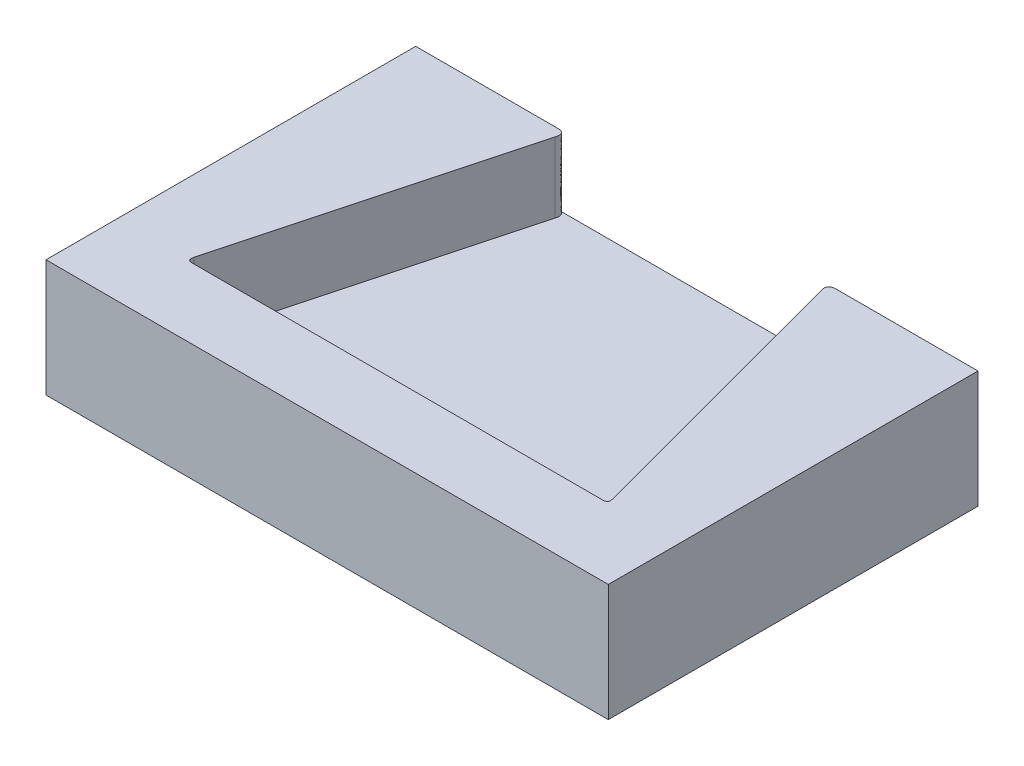
ISO-10303-21;
HEADER;
FILE_DESCRIPTION(('STEP AP214'),'2;1');
FILE_NAME('part.step','',(''),(''),'','','');
FILE_SCHEMA(('AUTOMOTIVE_DESIGN { 1 0 10303 214 1 1 1 1 }'));
ENDSEC;
DATA;
#1=APPLICATION_CONTEXT('core data for automotive mechanical design processes');
#2=APPLICATION_PROTOCOL_DEFINITION('international standard','automotive_design',2000,#1);
#3=PRODUCT_CONTEXT('',#1,'mechanical');
#4=PRODUCT('Part','Part','',(#3));
#5=PRODUCT_RELATED_PRODUCT_CATEGORY('part','',(#4));
#6=PRODUCT_DEFINITION_FORMATION('','',#4);
#7=PRODUCT_DEFINITION_CONTEXT('part definition',#1,'design');
#8=PRODUCT_DEFINITION('design','',#6,#7);
#9=PRODUCT_DEFINITION_SHAPE('','',#8);
#10=(LENGTH_UNIT() NAMED_UNIT(*) SI_UNIT(.MILLI.,.METRE.));
#11=(NAMED_UNIT(*) PLANE_ANGLE_UNIT() SI_UNIT($,.RADIAN.));
#12=(NAMED_UNIT(*) SI_UNIT($,.STERADIAN.) SOLID_ANGLE_UNIT());
#13=UNCERTAINTY_MEASURE_WITH_UNIT(LENGTH_MEASURE(1.E-05),#10,'distance_accuracy_value','');
#14=(GEOMETRIC_REPRESENTATION_CONTEXT(3) GLOBAL_UNCERTAINTY_ASSIGNED_CONTEXT((#13)) GLOBAL_UNIT_ASSIGNED_CONTEXT((#10,
#11,#12)) REPRESENTATION_CONTEXT('',''));
#15=CARTESIAN_POINT('',(0.,0.,0.));
#16=DIRECTION('',(0.,0.,1.));
#17=DIRECTION('',(1.,0.,0.));
#18=AXIS2_PLACEMENT_3D('',#15,#16,#17);
#19=CARTESIAN_POINT('',(0.,5.,0.));
#20=DIRECTION('',(1.,0.,0.));
#21=DIRECTION('',(0.,0.,-1.));
#22=AXIS2_PLACEMENT_3D('',#19,#20,#21);
#23=PLANE('',#22);
#24=DIRECTION('',(0.,0.,1.));
#25=VECTOR('',#24,1.);
#26=CARTESIAN_POINT('',(0.,0.,0.));
#27=LINE('',#26,#25);
#28=CARTESIAN_POINT('',(0.,0.,-15.78));
#29=VERTEX_POINT('',#28);
#30=CARTESIAN_POINT('',(0.,0.,0.));
#31=VERTEX_POINT('',#30);
#32=EDGE_CURVE('E163',#29,#31,#27,.T.);
#33=ORIENTED_EDGE('',*,*,#32,.T.);
#34=DIRECTION('',(0.,-1.,0.));
#35=VECTOR('',#34,1.);
#36=CARTESIAN_POINT('',(0.,5.,0.));
#37=LINE('',#36,#35);
#38=CARTESIAN_POINT('',(0.,5.,0.));
#39=VERTEX_POINT('',#38);
#40=EDGE_CURVE('E143',#39,#31,#37,.T.);
#41=ORIENTED_EDGE('',*,*,#40,.F.);
#42=DIRECTION('',(0.,0.,1.));
#43=VECTOR('',#42,1.);
#44=CARTESIAN_POINT('',(0.,5.,0.));
#45=LINE('',#44,#43);
#46=CARTESIAN_POINT('',(0.,5.,-15.78));
#47=VERTEX_POINT('',#46);
#48=EDGE_CURVE('E150',#47,#39,#45,.T.);
#49=ORIENTED_EDGE('',*,*,#48,.F.);
#50=DIRECTION('',(0.,-1.,0.));
#51=VECTOR('',#50,1.);
#52=CARTESIAN_POINT('',(0.,5.,-15.78));
#53=LINE('',#52,#51);
#54=EDGE_CURVE('E195',#47,#29,#53,.T.);
#55=ORIENTED_EDGE('',*,*,#54,.T.);
#56=EDGE_LOOP('',(#33,#41,#49,#55));
#57=FACE_BOUND('',#56,.T.);
#58=ADVANCED_FACE('F43',(#57),#23,.F.);
#59=CARTESIAN_POINT('',(0.,5.,0.));
#60=DIRECTION('',(0.,0.,-1.));
#61=DIRECTION('',(-1.,0.,0.));
#62=AXIS2_PLACEMENT_3D('',#59,#60,#61);
#63=PLANE('',#62);
#64=DIRECTION('',(1.,0.,0.));
#65=VECTOR('',#64,1.);
#66=CARTESIAN_POINT('',(0.,0.,0.));
#67=LINE('',#66,#65);
#68=CARTESIAN_POINT('',(24.,0.,0.));
#69=VERTEX_POINT('',#68);
#70=EDGE_CURVE('E529',#31,#69,#67,.T.);
#71=ORIENTED_EDGE('',*,*,#70,.T.);
#72=DIRECTION('',(0.,-1.,0.));
#73=VECTOR('',#72,1.);
#74=CARTESIAN_POINT('',(24.,5.,0.));
#75=LINE('',#74,#73);
#76=CARTESIAN_POINT('',(24.,5.,0.));
#77=VERTEX_POINT('',#76);
#78=EDGE_CURVE('E146',#77,#69,#75,.T.);
#79=ORIENTED_EDGE('',*,*,#78,.F.);
#80=DIRECTION('',(1.,0.,0.));
#81=VECTOR('',#80,1.);
#82=CARTESIAN_POINT('',(0.,5.,0.));
#83=LINE('',#82,#81);
#84=EDGE_CURVE('E139',#39,#77,#83,.T.);
#85=ORIENTED_EDGE('',*,*,#84,.F.);
#86=ORIENTED_EDGE('',*,*,#40,.T.);
#87=EDGE_LOOP('',(#71,#79,#85,#86));
#88=FACE_BOUND('',#87,.T.);
#89=ADVANCED_FACE('F141',(#88),#63,.F.);
#90=CARTESIAN_POINT('',(24.,5.,0.));
#91=DIRECTION('',(-1.,0.,0.));
#92=DIRECTION('',(0.,0.,1.));
#93=AXIS2_PLACEMENT_3D('',#90,#91,#92);
#94=PLANE('',#93);
#95=DIRECTION('',(0.,0.,-1.));
#96=VECTOR('',#95,1.);
#97=CARTESIAN_POINT('',(24.,0.,0.));
#98=LINE('',#97,#96);
#99=CARTESIAN_POINT('',(24.,0.,-15.78));
#100=VERTEX_POINT('',#99);
#101=EDGE_CURVE('E530',#69,#100,#98,.T.);
#102=ORIENTED_EDGE('',*,*,#101,.T.);
#103=DIRECTION('',(0.,-1.,0.));
#104=VECTOR('',#103,1.);
#105=CARTESIAN_POINT('',(24.,5.,-15.78));
#106=LINE('',#105,#104);
#107=CARTESIAN_POINT('',(24.,5.,-15.78));
#108=VERTEX_POINT('',#107);
#109=EDGE_CURVE('E168',#108,#100,#106,.T.);
#110=ORIENTED_EDGE('',*,*,#109,.F.);
#111=DIRECTION('',(0.,0.,-1.));
#112=VECTOR('',#111,1.);
#113=CARTESIAN_POINT('',(24.,5.,0.));
#114=LINE('',#113,#112);
#115=EDGE_CURVE('E149',#77,#108,#114,.T.);
#116=ORIENTED_EDGE('',*,*,#115,.F.);
#117=ORIENTED_EDGE('',*,*,#78,.T.);
#118=EDGE_LOOP('',(#102,#110,#116,#117));
#119=FACE_BOUND('',#118,.T.);
#120=ADVANCED_FACE('F544',(#119),#94,.F.);
#121=CARTESIAN_POINT('',(0.,5.,-15.78));
#122=DIRECTION('',(0.,0.,1.));
#123=DIRECTION('',(1.,0.,0.));
#124=AXIS2_PLACEMENT_3D('',#121,#122,#123);
#125=PLANE('',#124);
#126=DIRECTION('',(-1.,0.,0.));
#127=VECTOR('',#126,1.);
#128=CARTESIAN_POINT('',(0.,5.,-15.78));
#129=LINE('',#128,#127);
#130=CARTESIAN_POINT('',(6.03342306741735,5.,-15.78));
#131=VERTEX_POINT('',#130);
#132=EDGE_CURVE('E156',#131,#47,#129,.T.);
#133=ORIENTED_EDGE('',*,*,#132,.F.);
#134=CARTESIAN_POINT('',(6.03342306741735,1.85,-15.78));
#135=CARTESIAN_POINT('',(6.03342306741735,2.94999999999991,-15.78));
#136=CARTESIAN_POINT('',(6.03342306741735,4.05000000000191,-15.78));
#137=CARTESIAN_POINT('',(6.03342306741735,5.15,-15.78));
#138=B_SPLINE_CURVE_WITH_KNOTS('',3,(#134,#135,#136,#137),.UNSPECIFIED.,.F.,.F.,(4,4),(-0.00015,
0.00315),.UNSPECIFIED.);
#139=CARTESIAN_POINT('',(6.03342306741735,2.,-15.78));
#140=VERTEX_POINT('',#139);
#141=EDGE_CURVE('E479',#131,#140,#138,.F.);
#142=ORIENTED_EDGE('',*,*,#141,.T.);
#143=DIRECTION('',(-1.,0.,0.));
#144=VECTOR('',#143,1.);
#145=CARTESIAN_POINT('',(17.5756093207303,2.,-15.78));
#146=LINE('',#145,#144);
#147=CARTESIAN_POINT('',(17.9665769325827,2.,-15.78));
#148=VERTEX_POINT('',#147);
#149=EDGE_CURVE('E71',#148,#140,#146,.T.);
#150=ORIENTED_EDGE('',*,*,#149,.F.);
#151=CARTESIAN_POINT('',(17.9665769325827,5.15,-15.78));
#152=CARTESIAN_POINT('',(17.9665769325827,4.04999999999985,-15.78));
#153=CARTESIAN_POINT('',(17.9665769325827,2.95,-15.78));
#154=CARTESIAN_POINT('',(17.9665769325827,1.85,-15.78));
#155=B_SPLINE_CURVE_WITH_KNOTS('',3,(#151,#152,#153,#154),.UNSPECIFIED.,.F.,.F.,(4,4),(-0.00315,
0.00015),.UNSPECIFIED.);
#156=CARTESIAN_POINT('',(17.9665769325827,5.,-15.78));
#157=VERTEX_POINT('',#156);
#158=EDGE_CURVE('E501',#148,#157,#155,.F.);
#159=ORIENTED_EDGE('',*,*,#158,.T.);
#160=EDGE_CURVE('E192',#108,#157,#129,.T.);
#161=ORIENTED_EDGE('',*,*,#160,.F.);
#162=ORIENTED_EDGE('',*,*,#109,.T.);
#163=DIRECTION('',(-1.,0.,0.));
#164=VECTOR('',#163,1.);
#165=CARTESIAN_POINT('',(0.,0.,-15.78));
#166=LINE('',#165,#164);
#167=EDGE_CURVE('E160',#100,#29,#166,.T.);
#168=ORIENTED_EDGE('',*,*,#167,.T.);
#169=ORIENTED_EDGE('',*,*,#54,.F.);
#170=EDGE_LOOP('',(#133,#142,#150,#159,#161,#162,#168,#169));
#171=FACE_BOUND('',#170,.T.);
#172=ADVANCED_FACE('F539',(#171),#125,.F.);
#173=CARTESIAN_POINT('',(0.,5.,0.));
#174=DIRECTION('',(0.,-1.,0.));
#175=DIRECTION('',(0.,0.,-1.));
#176=AXIS2_PLACEMENT_3D('',#173,#174,#175);
#177=PLANE('',#176);
#178=DIRECTION('',(-0.258819045102518,0.,0.965925826289069));
#179=VECTOR('',#178,1.);
#180=CARTESIAN_POINT('',(6.42439067926971,5.,-15.78));
#181=LINE('',#180,#179);
#182=CARTESIAN_POINT('',(6.32320081530407,5.,-15.4023542864692));
#183=VERTEX_POINT('',#182);
#184=CARTESIAN_POINT('',(3.06745990931043,5.,-3.2517638090205));
#185=VERTEX_POINT('',#184);
#186=EDGE_CURVE('E355',#183,#185,#181,.T.);
#187=ORIENTED_EDGE('',*,*,#186,.F.);
#188=CARTESIAN_POINT('',(6.03342306741735,5.,-15.78));
#189=CARTESIAN_POINT('',(6.09603295456339,5.,-15.78));
#190=CARTESIAN_POINT('',(6.15864284170943,5.,-15.78));
#191=CARTESIAN_POINT('',(6.29435593668985,5.,-15.7481926618959));
#192=CARTESIAN_POINT('',(6.36001168202481,5.,-15.6626284287026));
#193=CARTESIAN_POINT('',(6.3556100777143,5.,-15.5233073004201));
#194=CARTESIAN_POINT('',(6.33940544650918,5.,-15.4628307934446));
#195=CARTESIAN_POINT('',(6.32320081530407,5.,-15.4023542864692));
#196=B_SPLINE_CURVE_WITH_KNOTS('',5,(#188,#189,#190,#191,#192,#193,#194,#195),.UNSPECIFIED.,.F.,
.F.,(6,2,6),(0.,0.5,1.),.UNSPECIFIED.);
#197=EDGE_CURVE('E439',#183,#131,#196,.F.);
#198=ORIENTED_EDGE('',*,*,#197,.T.);
#199=ORIENTED_EDGE('',*,*,#132,.T.);
#200=ORIENTED_EDGE('',*,*,#48,.T.);
#201=ORIENTED_EDGE('',*,*,#84,.T.);
#202=ORIENTED_EDGE('',*,*,#115,.T.);
#203=ORIENTED_EDGE('',*,*,#160,.T.);
#204=CARTESIAN_POINT('',(17.6767991846959,5.,-15.4023542864692));
#205=CARTESIAN_POINT('',(17.6605945534908,5.,-15.4628307934446));
#206=CARTESIAN_POINT('',(17.6443899222857,5.,-15.5233073004201));
#207=CARTESIAN_POINT('',(17.6399883179752,5.,-15.6626284287026));
#208=CARTESIAN_POINT('',(17.7056440633101,5.,-15.7481926618959));
#209=CARTESIAN_POINT('',(17.8413571582906,5.,-15.78));
#210=CARTESIAN_POINT('',(17.9039670454366,5.,-15.78));
#211=CARTESIAN_POINT('',(17.9665769325827,5.,-15.78));
#212=B_SPLINE_CURVE_WITH_KNOTS('',5,(#204,#205,#206,#207,#208,#209,#210,#211),.UNSPECIFIED.,.F.,
.F.,(6,2,6),(0.,0.5,1.),.UNSPECIFIED.);
#213=CARTESIAN_POINT('',(17.6767991846959,5.,-15.4023542864693));
#214=VERTEX_POINT('',#213);
#215=EDGE_CURVE('E490',#157,#214,#212,.F.);
#216=ORIENTED_EDGE('',*,*,#215,.T.);
#217=DIRECTION('',(-0.258819045102518,0.,-0.965925826289069));
#218=VECTOR('',#217,1.);
#219=CARTESIAN_POINT('',(21.,5.,-3.));
#220=LINE('',#219,#218);
#221=CARTESIAN_POINT('',(20.9325400906896,5.,-3.2517638090205));
#222=VERTEX_POINT('',#221);
#223=EDGE_CURVE('E172',#222,#214,#220,.T.);
#224=ORIENTED_EDGE('',*,*,#223,.F.);
#225=CARTESIAN_POINT('',(20.7393549254318,5.,-3.));
#226=CARTESIAN_POINT('',(20.7810948501958,5.,-3.));
#227=CARTESIAN_POINT('',(20.8228347749598,5.,-3.));
#228=CARTESIAN_POINT('',(20.9133101716134,5.00000000000001,-3.02120489206938));
#229=CARTESIAN_POINT('',(20.9570806685034,5.00000000000001,-3.07824771419826));
#230=CARTESIAN_POINT('',(20.9541462656297,5.,-3.17112846638663));
#231=CARTESIAN_POINT('',(20.9433431781596,5.,-3.21144613770357));
#232=CARTESIAN_POINT('',(20.9325400906896,5.,-3.2517638090205));
#233=B_SPLINE_CURVE_WITH_KNOTS('',5,(#225,#226,#227,#228,#229,#230,#231,#232),.UNSPECIFIED.,.F.,
.F.,(6,2,6),(0.,0.5,1.),.UNSPECIFIED.);
#234=CARTESIAN_POINT('',(20.7393549254318,5.,-3.));
#235=VERTEX_POINT('',#234);
#236=EDGE_CURVE('E235',#222,#235,#233,.F.);
#237=ORIENTED_EDGE('',*,*,#236,.T.);
#238=DIRECTION('',(1.,0.,0.));
#239=VECTOR('',#238,1.);
#240=CARTESIAN_POINT('',(3.,5.,-3.));
#241=LINE('',#240,#239);
#242=CARTESIAN_POINT('',(3.26064507456824,5.,-3.));
#243=VERTEX_POINT('',#242);
#244=EDGE_CURVE('E175',#243,#235,#241,.T.);
#245=ORIENTED_EDGE('',*,*,#244,.F.);
#246=CARTESIAN_POINT('',(3.06745990931043,5.,-3.2517638090205));
#247=CARTESIAN_POINT('',(3.05665682184035,5.,-3.21144613770357));
#248=CARTESIAN_POINT('',(3.04585373437028,5.,-3.17112846638663));
#249=CARTESIAN_POINT('',(3.0429193314966,5.00000000000001,-3.07824771419826));
#250=CARTESIAN_POINT('',(3.08668982838657,5.00000000000001,-3.02120489206938));
#251=CARTESIAN_POINT('',(3.17716522504019,5.,-3.));
#252=CARTESIAN_POINT('',(3.21890514980422,5.,-3.));
#253=CARTESIAN_POINT('',(3.26064507456824,5.,-3.));
#254=B_SPLINE_CURVE_WITH_KNOTS('',5,(#246,#247,#248,#249,#250,#251,#252,#253),.UNSPECIFIED.,.F.,
.F.,(6,2,6),(0.,0.5,1.),.UNSPECIFIED.);
#255=EDGE_CURVE('E247',#243,#185,#254,.F.);
#256=ORIENTED_EDGE('',*,*,#255,.T.);
#257=EDGE_LOOP('',(#187,#198,#199,#200,#201,#202,#203,#216,#224,#237,#245,#256));
#258=FACE_BOUND('',#257,.T.);
#259=ADVANCED_FACE('F154',(#258),#177,.F.);
#260=CARTESIAN_POINT('',(0.,0.,0.));
#261=DIRECTION('',(0.,-1.,0.));
#262=DIRECTION('',(0.,0.,-1.));
#263=AXIS2_PLACEMENT_3D('',#260,#261,#262);
#264=PLANE('',#263);
#265=ORIENTED_EDGE('',*,*,#32,.F.);
#266=ORIENTED_EDGE('',*,*,#167,.F.);
#267=ORIENTED_EDGE('',*,*,#101,.F.);
#268=ORIENTED_EDGE('',*,*,#70,.F.);
#269=EDGE_LOOP('',(#265,#266,#267,#268));
#270=FACE_BOUND('',#269,.T.);
#271=ADVANCED_FACE('F543',(#270),#264,.T.);
#272=CARTESIAN_POINT('',(21.,2.,-3.));
#273=DIRECTION('',(0.965925826289069,0.,-0.258819045102518));
#274=DIRECTION('',(-0.258819045102518,0.,-0.965925826289069));
#275=AXIS2_PLACEMENT_3D('',#272,#273,#274);
#276=PLANE('',#275);
#277=ORIENTED_EDGE('',*,*,#223,.T.);
#278=CARTESIAN_POINT('',(17.6767991846959,1.85,-15.4023542864692));
#279=CARTESIAN_POINT('',(17.6767991846959,2.95,-15.4023542864692));
#280=CARTESIAN_POINT('',(17.6767991846959,4.04999999999985,-15.4023542864692));
#281=CARTESIAN_POINT('',(17.6767991846959,5.15,-15.4023542864692));
#282=B_SPLINE_CURVE_WITH_KNOTS('',3,(#278,#279,#280,#281),.UNSPECIFIED.,.F.,.F.,(4,4),(-0.00315,
0.00015),.UNSPECIFIED.);
#283=CARTESIAN_POINT('',(17.6767991846959,2.,-15.4023542864693));
#284=VERTEX_POINT('',#283);
#285=EDGE_CURVE('E63',#214,#284,#282,.F.);
#286=ORIENTED_EDGE('',*,*,#285,.T.);
#287=DIRECTION('',(-0.258819045102518,0.,-0.965925826289069));
#288=VECTOR('',#287,1.);
#289=CARTESIAN_POINT('',(21.,2.,-3.));
#290=LINE('',#289,#288);
#291=CARTESIAN_POINT('',(20.9325400906896,2.,-3.2517638090205));
#292=VERTEX_POINT('',#291);
#293=EDGE_CURVE('E176',#292,#284,#290,.T.);
#294=ORIENTED_EDGE('',*,*,#293,.F.);
#295=CARTESIAN_POINT('',(20.9325400906896,5.15,-3.2517638090205));
#296=CARTESIAN_POINT('',(20.9325400906896,4.05,-3.2517638090205));
#297=CARTESIAN_POINT('',(20.9325400906896,2.94999999999991,-3.2517638090205));
#298=CARTESIAN_POINT('',(20.9325400906896,1.85,-3.2517638090205));
#299=B_SPLINE_CURVE_WITH_KNOTS('',3,(#295,#296,#297,#298),.UNSPECIFIED.,.F.,.F.,(4,4),(-0.00315,
0.00015),.UNSPECIFIED.);
#300=EDGE_CURVE('E164',#292,#222,#299,.F.);
#301=ORIENTED_EDGE('',*,*,#300,.T.);
#302=EDGE_LOOP('',(#277,#286,#294,#301));
#303=FACE_BOUND('',#302,.T.);
#304=ADVANCED_FACE('F406',(#303),#276,.F.);
#305=CARTESIAN_POINT('',(3.,2.,-3.));
#306=DIRECTION('',(0.,0.,1.));
#307=DIRECTION('',(1.,0.,0.));
#308=AXIS2_PLACEMENT_3D('',#305,#306,#307);
#309=PLANE('',#308);
#310=ORIENTED_EDGE('',*,*,#244,.T.);
#311=CARTESIAN_POINT('',(20.7393549254318,1.85,-3.));
#312=CARTESIAN_POINT('',(20.7393549254318,2.94999999999991,-3.));
#313=CARTESIAN_POINT('',(20.7393549254318,4.05,-3.));
#314=CARTESIAN_POINT('',(20.7393549254318,5.15,-3.));
#315=B_SPLINE_CURVE_WITH_KNOTS('',3,(#311,#312,#313,#314),.UNSPECIFIED.,.F.,.F.,(4,4),(-0.00315,
0.00015),.UNSPECIFIED.);
#316=CARTESIAN_POINT('',(20.7393549254318,2.,-3.));
#317=VERTEX_POINT('',#316);
#318=EDGE_CURVE('E309',#235,#317,#315,.F.);
#319=ORIENTED_EDGE('',*,*,#318,.T.);
#320=DIRECTION('',(1.,0.,0.));
#321=VECTOR('',#320,1.);
#322=CARTESIAN_POINT('',(3.,2.,-3.));
#323=LINE('',#322,#321);
#324=CARTESIAN_POINT('',(3.26064507456824,2.,-3.));
#325=VERTEX_POINT('',#324);
#326=EDGE_CURVE('E369',#325,#317,#323,.T.);
#327=ORIENTED_EDGE('',*,*,#326,.F.);
#328=CARTESIAN_POINT('',(3.26064507456824,5.15,-3.));
#329=CARTESIAN_POINT('',(3.26064507456824,4.05,-3.));
#330=CARTESIAN_POINT('',(3.26064507456824,2.94999999999991,-3.));
#331=CARTESIAN_POINT('',(3.26064507456824,1.85,-3.));
#332=B_SPLINE_CURVE_WITH_KNOTS('',3,(#328,#329,#330,#331),.UNSPECIFIED.,.F.,.F.,(4,4),(-0.00315,
0.00015),.UNSPECIFIED.);
#333=EDGE_CURVE('E167',#325,#243,#332,.F.);
#334=ORIENTED_EDGE('',*,*,#333,.T.);
#335=EDGE_LOOP('',(#310,#319,#327,#334));
#336=FACE_BOUND('',#335,.T.);
#337=ADVANCED_FACE('F213',(#336),#309,.F.);
#338=CARTESIAN_POINT('',(6.42439067926971,2.,-15.78));
#339=DIRECTION('',(-0.965925826289069,0.,-0.258819045102518));
#340=DIRECTION('',(-0.258819045102518,0.,0.965925826289069));
#341=AXIS2_PLACEMENT_3D('',#338,#339,#340);
#342=PLANE('',#341);
#343=DIRECTION('',(-0.258819045102518,0.,0.965925826289069));
#344=VECTOR('',#343,1.);
#345=CARTESIAN_POINT('',(6.42439067926971,2.,-15.78));
#346=LINE('',#345,#344);
#347=CARTESIAN_POINT('',(6.32320081530407,2.,-15.4023542864692));
#348=VERTEX_POINT('',#347);
#349=CARTESIAN_POINT('',(3.06745990931043,2.,-3.2517638090205));
#350=VERTEX_POINT('',#349);
#351=EDGE_CURVE('E361',#348,#350,#346,.T.);
#352=ORIENTED_EDGE('',*,*,#351,.F.);
#353=CARTESIAN_POINT('',(6.32320081530407,5.15,-15.4023542864692));
#354=CARTESIAN_POINT('',(6.32320081530407,4.05000000000191,-15.4023542864692));
#355=CARTESIAN_POINT('',(6.32320081530407,2.94999999999991,-15.4023542864692));
#356=CARTESIAN_POINT('',(6.32320081530407,1.85,-15.4023542864692));
#357=B_SPLINE_CURVE_WITH_KNOTS('',3,(#353,#354,#355,#356),.UNSPECIFIED.,.F.,.F.,(4,4),(-0.00015,
0.00315),.UNSPECIFIED.);
#358=EDGE_CURVE('E545',#348,#183,#357,.F.);
#359=ORIENTED_EDGE('',*,*,#358,.T.);
#360=ORIENTED_EDGE('',*,*,#186,.T.);
#361=CARTESIAN_POINT('',(3.06745990931043,1.85,-3.2517638090205));
#362=CARTESIAN_POINT('',(3.06745990931043,2.94999999999991,-3.2517638090205));
#363=CARTESIAN_POINT('',(3.06745990931043,4.05,-3.2517638090205));
#364=CARTESIAN_POINT('',(3.06745990931043,5.15,-3.2517638090205));
#365=B_SPLINE_CURVE_WITH_KNOTS('',3,(#361,#362,#363,#364),.UNSPECIFIED.,.F.,.F.,(4,4),(-0.00315,
0.00015),.UNSPECIFIED.);
#366=EDGE_CURVE('E351',#185,#350,#365,.F.);
#367=ORIENTED_EDGE('',*,*,#366,.T.);
#368=EDGE_LOOP('',(#352,#359,#360,#367));
#369=FACE_BOUND('',#368,.T.);
#370=ADVANCED_FACE('F202',(#369),#342,.F.);
#371=CARTESIAN_POINT('',(0.,2.,0.));
#372=DIRECTION('',(0.,1.,0.));
#373=DIRECTION('',(0.,0.,1.));
#374=AXIS2_PLACEMENT_3D('',#371,#372,#373);
#375=PLANE('',#374);
#376=ORIENTED_EDGE('',*,*,#326,.T.);
#377=CARTESIAN_POINT('',(20.9325400906896,1.99999999999994,-3.2517638090205));
#378=CARTESIAN_POINT('',(20.9433431781596,1.99999999999994,-3.21144613770357));
#379=CARTESIAN_POINT('',(20.9541462656297,1.99999999999994,-3.17112846638663));
#380=CARTESIAN_POINT('',(20.9570806685034,2.0000000000001,-3.07824771419826));
#381=CARTESIAN_POINT('',(20.9133101716134,2.0000000000001,-3.02120489206938));
#382=CARTESIAN_POINT('',(20.8228347749598,1.99999999999994,-3.));
#383=CARTESIAN_POINT('',(20.7810948501958,1.99999999999994,-3.));
#384=CARTESIAN_POINT('',(20.7393549254318,1.99999999999994,-3.));
#385=B_SPLINE_CURVE_WITH_KNOTS('',5,(#377,#378,#379,#380,#381,#382,#383,#384),.UNSPECIFIED.,.F.,
.F.,(6,2,6),(0.,0.5,1.),.UNSPECIFIED.);
#386=EDGE_CURVE('E528',#317,#292,#385,.F.);
#387=ORIENTED_EDGE('',*,*,#386,.T.);
#388=ORIENTED_EDGE('',*,*,#293,.T.);
#389=CARTESIAN_POINT('',(17.9665769325827,2.,-15.78));
#390=CARTESIAN_POINT('',(17.9039670454366,2.,-15.78));
#391=CARTESIAN_POINT('',(17.8413571582906,2.,-15.78));
#392=CARTESIAN_POINT('',(17.7056440633101,2.,-15.7481926618959));
#393=CARTESIAN_POINT('',(17.6399883179752,2.,-15.6626284287026));
#394=CARTESIAN_POINT('',(17.6443899222857,2.,-15.5233073004201));
#395=CARTESIAN_POINT('',(17.6605945534908,2.,-15.4628307934446));
#396=CARTESIAN_POINT('',(17.6767991846959,2.,-15.4023542864692));
#397=B_SPLINE_CURVE_WITH_KNOTS('',5,(#389,#390,#391,#392,#393,#394,#395,#396),.UNSPECIFIED.,.F.,
.F.,(6,2,6),(0.,0.5,1.),.UNSPECIFIED.);
#398=EDGE_CURVE('E11',#284,#148,#397,.F.);
#399=ORIENTED_EDGE('',*,*,#398,.T.);
#400=ORIENTED_EDGE('',*,*,#149,.T.);
#401=CARTESIAN_POINT('',(6.32320081530407,1.99999999999995,-15.4023542864692));
#402=CARTESIAN_POINT('',(6.33940544650918,1.99999999999995,-15.4628307934446));
#403=CARTESIAN_POINT('',(6.3556100777143,1.99999999999995,-15.5233073004201));
#404=CARTESIAN_POINT('',(6.36001168202481,2.00000000000008,-15.6626284287026));
#405=CARTESIAN_POINT('',(6.29435593668986,2.00000000000008,-15.7481926618959));
#406=CARTESIAN_POINT('',(6.15864284170943,1.99999999999995,-15.78));
#407=CARTESIAN_POINT('',(6.09603295456339,1.99999999999995,-15.78));
#408=CARTESIAN_POINT('',(6.03342306741735,1.99999999999995,-15.78));
#409=B_SPLINE_CURVE_WITH_KNOTS('',5,(#401,#402,#403,#404,#405,#406,#407,#408),.UNSPECIFIED.,.F.,
.F.,(6,2,6),(0.,0.5,1.),.UNSPECIFIED.);
#410=EDGE_CURVE('E56',#140,#348,#409,.F.);
#411=ORIENTED_EDGE('',*,*,#410,.T.);
#412=ORIENTED_EDGE('',*,*,#351,.T.);
#413=CARTESIAN_POINT('',(3.26064507456824,1.99999999999994,-3.));
#414=CARTESIAN_POINT('',(3.21890514980422,1.99999999999994,-3.));
#415=CARTESIAN_POINT('',(3.17716522504019,1.99999999999994,-3.));
#416=CARTESIAN_POINT('',(3.08668982838657,2.0000000000001,-3.02120489206938));
#417=CARTESIAN_POINT('',(3.0429193314966,2.0000000000001,-3.07824771419826));
#418=CARTESIAN_POINT('',(3.04585373437028,1.99999999999994,-3.17112846638663));
#419=CARTESIAN_POINT('',(3.05665682184035,1.99999999999994,-3.21144613770357));
#420=CARTESIAN_POINT('',(3.06745990931043,1.99999999999994,-3.2517638090205));
#421=B_SPLINE_CURVE_WITH_KNOTS('',5,(#413,#414,#415,#416,#417,#418,#419,#420),.UNSPECIFIED.,.F.,
.F.,(6,2,6),(0.,0.5,1.),.UNSPECIFIED.);
#422=EDGE_CURVE('E341',#350,#325,#421,.F.);
#423=ORIENTED_EDGE('',*,*,#422,.T.);
#424=EDGE_LOOP('',(#376,#387,#388,#399,#400,#411,#412,#423));
#425=FACE_BOUND('',#424,.T.);
#426=ADVANCED_FACE('F212',(#425),#375,.T.);
#427=CARTESIAN_POINT('',(20.7393549254318,5.15,-3.));
#428=CARTESIAN_POINT('',(20.7393549254318,4.05,-3.));
#429=CARTESIAN_POINT('',(20.7393549254318,2.94999999999991,-3.));
#430=CARTESIAN_POINT('',(20.7393549254318,1.85,-3.));
#431=CARTESIAN_POINT('',(20.7810948501958,5.15,-3.));
#432=CARTESIAN_POINT('',(20.7810948501958,4.05,-3.));
#433=CARTESIAN_POINT('',(20.7810948501958,2.94999999999991,-3.));
#434=CARTESIAN_POINT('',(20.7810948501958,1.85,-3.));
#435=CARTESIAN_POINT('',(20.8228347749598,5.15,-3.));
#436=CARTESIAN_POINT('',(20.8228347749598,4.05,-3.));
#437=CARTESIAN_POINT('',(20.8228347749598,2.94999999999991,-3.));
#438=CARTESIAN_POINT('',(20.8228347749598,1.85,-3.));
#439=CARTESIAN_POINT('',(20.9133101716134,5.15,-3.02120489206938));
#440=CARTESIAN_POINT('',(20.9133101716134,4.05,-3.02120489206938));
#441=CARTESIAN_POINT('',(20.9133101716134,2.95000000000122,-3.02120489206938));
#442=CARTESIAN_POINT('',(20.9133101716134,1.85,-3.02120489206938));
#443=CARTESIAN_POINT('',(20.9570806685034,5.15,-3.07824771419826));
#444=CARTESIAN_POINT('',(20.9570806685034,4.05,-3.07824771419826));
#445=CARTESIAN_POINT('',(20.9570806685034,2.95000000000122,-3.07824771419826));
#446=CARTESIAN_POINT('',(20.9570806685034,1.85,-3.07824771419826));
#447=CARTESIAN_POINT('',(20.9541462656297,5.15,-3.17112846638663));
#448=CARTESIAN_POINT('',(20.9541462656297,4.05,-3.17112846638663));
#449=CARTESIAN_POINT('',(20.9541462656297,2.94999999999991,-3.17112846638663));
#450=CARTESIAN_POINT('',(20.9541462656297,1.85,-3.17112846638663));
#451=CARTESIAN_POINT('',(20.9433431781596,5.15,-3.21144613770357));
#452=CARTESIAN_POINT('',(20.9433431781596,4.05,-3.21144613770357));
#453=CARTESIAN_POINT('',(20.9433431781596,2.94999999999991,-3.21144613770357));
#454=CARTESIAN_POINT('',(20.9433431781596,1.85,-3.21144613770357));
#455=CARTESIAN_POINT('',(20.9325400906896,5.15,-3.2517638090205));
#456=CARTESIAN_POINT('',(20.9325400906896,4.05,-3.2517638090205));
#457=CARTESIAN_POINT('',(20.9325400906896,2.94999999999991,-3.2517638090205));
#458=CARTESIAN_POINT('',(20.9325400906896,1.85,-3.2517638090205));
#459=B_SPLINE_SURFACE_WITH_KNOTS('',5,3,((#427,#428,#429,#430),(#431,#432,#433,#434),(#435,#436,
#437,#438),(#439,#440,#441,#442),(#443,#444,#445,#446),(#447,#448,#449,#450),(#451,#452,#453,
#454),(#455,#456,#457,#458)),.UNSPECIFIED.,.F.,.F.,.F.,(6,2,6),(4,4),(0.,0.5,1.),(-0.00315,
0.00015),.UNSPECIFIED.);
#460=ORIENTED_EDGE('',*,*,#386,.F.);
#461=ORIENTED_EDGE('',*,*,#318,.F.);
#462=ORIENTED_EDGE('',*,*,#236,.F.);
#463=ORIENTED_EDGE('',*,*,#300,.F.);
#464=EDGE_LOOP('',(#460,#461,#462,#463));
#465=FACE_BOUND('',#464,.T.);
#466=ADVANCED_FACE('F267',(#465),#459,.T.);
#467=CARTESIAN_POINT('',(3.06745990931043,5.15,-3.2517638090205));
#468=CARTESIAN_POINT('',(3.06745990931043,4.05,-3.2517638090205));
#469=CARTESIAN_POINT('',(3.06745990931043,2.94999999999991,-3.2517638090205));
#470=CARTESIAN_POINT('',(3.06745990931043,1.85,-3.2517638090205));
#471=CARTESIAN_POINT('',(3.05665682184035,5.15,-3.21144613770357));
#472=CARTESIAN_POINT('',(3.05665682184035,4.05,-3.21144613770357));
#473=CARTESIAN_POINT('',(3.05665682184035,2.94999999999991,-3.21144613770357));
#474=CARTESIAN_POINT('',(3.05665682184035,1.85,-3.21144613770357));
#475=CARTESIAN_POINT('',(3.04585373437028,5.15,-3.17112846638663));
#476=CARTESIAN_POINT('',(3.04585373437028,4.05,-3.17112846638663));
#477=CARTESIAN_POINT('',(3.04585373437028,2.94999999999991,-3.17112846638663));
#478=CARTESIAN_POINT('',(3.04585373437028,1.85,-3.17112846638663));
#479=CARTESIAN_POINT('',(3.0429193314966,5.15,-3.07824771419826));
#480=CARTESIAN_POINT('',(3.0429193314966,4.05,-3.07824771419826));
#481=CARTESIAN_POINT('',(3.0429193314966,2.95000000000122,-3.07824771419826));
#482=CARTESIAN_POINT('',(3.0429193314966,1.85,-3.07824771419826));
#483=CARTESIAN_POINT('',(3.08668982838657,5.15,-3.02120489206938));
#484=CARTESIAN_POINT('',(3.08668982838657,4.05,-3.02120489206938));
#485=CARTESIAN_POINT('',(3.08668982838657,2.95000000000122,-3.02120489206938));
#486=CARTESIAN_POINT('',(3.08668982838657,1.85,-3.02120489206938));
#487=CARTESIAN_POINT('',(3.17716522504019,5.15,-3.));
#488=CARTESIAN_POINT('',(3.17716522504019,4.05,-3.));
#489=CARTESIAN_POINT('',(3.17716522504019,2.94999999999991,-3.));
#490=CARTESIAN_POINT('',(3.17716522504019,1.85,-3.));
#491=CARTESIAN_POINT('',(3.21890514980422,5.15,-3.));
#492=CARTESIAN_POINT('',(3.21890514980422,4.05,-3.));
#493=CARTESIAN_POINT('',(3.21890514980422,2.94999999999991,-3.));
#494=CARTESIAN_POINT('',(3.21890514980422,1.85,-3.));
#495=CARTESIAN_POINT('',(3.26064507456824,5.15,-3.));
#496=CARTESIAN_POINT('',(3.26064507456824,4.05,-3.));
#497=CARTESIAN_POINT('',(3.26064507456824,2.94999999999991,-3.));
#498=CARTESIAN_POINT('',(3.26064507456824,1.85,-3.));
#499=B_SPLINE_SURFACE_WITH_KNOTS('',5,3,((#467,#468,#469,#470),(#471,#472,#473,#474),(#475,#476,
#477,#478),(#479,#480,#481,#482),(#483,#484,#485,#486),(#487,#488,#489,#490),(#491,#492,#493,
#494),(#495,#496,#497,#498)),.UNSPECIFIED.,.F.,.F.,.F.,(6,2,6),(4,4),(0.,0.5,1.),(-0.00315,
0.00015),.UNSPECIFIED.);
#500=ORIENTED_EDGE('',*,*,#422,.F.);
#501=ORIENTED_EDGE('',*,*,#366,.F.);
#502=ORIENTED_EDGE('',*,*,#255,.F.);
#503=ORIENTED_EDGE('',*,*,#333,.F.);
#504=EDGE_LOOP('',(#500,#501,#502,#503));
#505=FACE_BOUND('',#504,.T.);
#506=ADVANCED_FACE('F282',(#505),#499,.T.);
#507=CARTESIAN_POINT('',(6.32320081530407,1.85,-15.4023542864692));
#508=CARTESIAN_POINT('',(6.32320081530407,2.94999999999991,-15.4023542864692));
#509=CARTESIAN_POINT('',(6.32320081530407,4.05000000000191,-15.4023542864692));
#510=CARTESIAN_POINT('',(6.32320081530407,5.15,-15.4023542864692));
#511=CARTESIAN_POINT('',(6.33940544650918,1.85,-15.4628307934446));
#512=CARTESIAN_POINT('',(6.33940544650918,2.94999999999991,-15.4628307934446));
#513=CARTESIAN_POINT('',(6.33940544650918,4.05000000000191,-15.4628307934446));
#514=CARTESIAN_POINT('',(6.33940544650918,5.15,-15.4628307934446));
#515=CARTESIAN_POINT('',(6.3556100777143,1.85,-15.5233073004201));
#516=CARTESIAN_POINT('',(6.3556100777143,2.94999999999991,-15.5233073004201));
#517=CARTESIAN_POINT('',(6.3556100777143,4.05000000000191,-15.5233073004201));
#518=CARTESIAN_POINT('',(6.3556100777143,5.15,-15.5233073004201));
#519=CARTESIAN_POINT('',(6.36001168202481,1.85,-15.6626284287026));
#520=CARTESIAN_POINT('',(6.36001168202481,2.95000000000098,-15.6626284287026));
#521=CARTESIAN_POINT('',(6.36001168202481,4.05000000000191,-15.6626284287026));
#522=CARTESIAN_POINT('',(6.36001168202481,5.15,-15.6626284287026));
#523=CARTESIAN_POINT('',(6.29435593668985,1.85,-15.7481926618959));
#524=CARTESIAN_POINT('',(6.29435593668985,2.95000000000098,-15.7481926618959));
#525=CARTESIAN_POINT('',(6.29435593668985,4.05000000000191,-15.7481926618959));
#526=CARTESIAN_POINT('',(6.29435593668985,5.15,-15.7481926618959));
#527=CARTESIAN_POINT('',(6.15864284170943,1.85,-15.78));
#528=CARTESIAN_POINT('',(6.15864284170943,2.94999999999991,-15.78));
#529=CARTESIAN_POINT('',(6.15864284170943,4.05000000000191,-15.78));
#530=CARTESIAN_POINT('',(6.15864284170943,5.15,-15.78));
#531=CARTESIAN_POINT('',(6.09603295456339,1.85,-15.78));
#532=CARTESIAN_POINT('',(6.09603295456339,2.94999999999991,-15.78));
#533=CARTESIAN_POINT('',(6.09603295456339,4.05000000000191,-15.78));
#534=CARTESIAN_POINT('',(6.09603295456339,5.15,-15.78));
#535=CARTESIAN_POINT('',(6.03342306741735,1.85,-15.78));
#536=CARTESIAN_POINT('',(6.03342306741735,2.94999999999991,-15.78));
#537=CARTESIAN_POINT('',(6.03342306741735,4.05000000000191,-15.78));
#538=CARTESIAN_POINT('',(6.03342306741735,5.15,-15.78));
#539=B_SPLINE_SURFACE_WITH_KNOTS('',5,3,((#507,#508,#509,#510),(#511,#512,#513,#514),(#515,#516,
#517,#518),(#519,#520,#521,#522),(#523,#524,#525,#526),(#527,#528,#529,#530),(#531,#532,#533,
#534),(#535,#536,#537,#538)),.UNSPECIFIED.,.F.,.F.,.F.,(6,2,6),(4,4),(0.,0.5,1.),(-0.00015,
0.00315),.UNSPECIFIED.);
#540=ORIENTED_EDGE('',*,*,#410,.F.);
#541=ORIENTED_EDGE('',*,*,#141,.F.);
#542=ORIENTED_EDGE('',*,*,#197,.F.);
#543=ORIENTED_EDGE('',*,*,#358,.F.);
#544=EDGE_LOOP('',(#540,#541,#542,#543));
#545=FACE_BOUND('',#544,.T.);
#546=ADVANCED_FACE('F445',(#545),#539,.T.);
#547=CARTESIAN_POINT('',(17.9665769325827,1.85,-15.78));
#548=CARTESIAN_POINT('',(17.9665769325827,2.95,-15.78));
#549=CARTESIAN_POINT('',(17.9665769325827,4.04999999999985,-15.78));
#550=CARTESIAN_POINT('',(17.9665769325827,5.15,-15.78));
#551=CARTESIAN_POINT('',(17.9039670454366,1.85,-15.78));
#552=CARTESIAN_POINT('',(17.9039670454366,2.95,-15.78));
#553=CARTESIAN_POINT('',(17.9039670454366,4.04999999999985,-15.78));
#554=CARTESIAN_POINT('',(17.9039670454366,5.15,-15.78));
#555=CARTESIAN_POINT('',(17.8413571582906,1.85,-15.78));
#556=CARTESIAN_POINT('',(17.8413571582906,2.95,-15.78));
#557=CARTESIAN_POINT('',(17.8413571582906,4.04999999999985,-15.78));
#558=CARTESIAN_POINT('',(17.8413571582906,5.15,-15.78));
#559=CARTESIAN_POINT('',(17.7056440633101,1.85,-15.7481926618959));
#560=CARTESIAN_POINT('',(17.7056440633101,2.95,-15.7481926618959));
#561=CARTESIAN_POINT('',(17.7056440633101,4.04999999999985,-15.7481926618959));
#562=CARTESIAN_POINT('',(17.7056440633101,5.15,-15.7481926618959));
#563=CARTESIAN_POINT('',(17.6399883179752,1.85,-15.6626284287026));
#564=CARTESIAN_POINT('',(17.6399883179752,2.95,-15.6626284287026));
#565=CARTESIAN_POINT('',(17.6399883179752,4.04999999999985,-15.6626284287026));
#566=CARTESIAN_POINT('',(17.6399883179752,5.15,-15.6626284287026));
#567=CARTESIAN_POINT('',(17.6443899222857,1.85,-15.5233073004201));
#568=CARTESIAN_POINT('',(17.6443899222857,2.95,-15.5233073004201));
#569=CARTESIAN_POINT('',(17.6443899222857,4.04999999999985,-15.5233073004201));
#570=CARTESIAN_POINT('',(17.6443899222857,5.15,-15.5233073004201));
#571=CARTESIAN_POINT('',(17.6605945534908,1.85,-15.4628307934446));
#572=CARTESIAN_POINT('',(17.6605945534908,2.95,-15.4628307934446));
#573=CARTESIAN_POINT('',(17.6605945534908,4.04999999999985,-15.4628307934446));
#574=CARTESIAN_POINT('',(17.6605945534908,5.15,-15.4628307934446));
#575=CARTESIAN_POINT('',(17.6767991846959,1.85,-15.4023542864692));
#576=CARTESIAN_POINT('',(17.6767991846959,2.95,-15.4023542864692));
#577=CARTESIAN_POINT('',(17.6767991846959,4.04999999999985,-15.4023542864692));
#578=CARTESIAN_POINT('',(17.6767991846959,5.15,-15.4023542864692));
#579=B_SPLINE_SURFACE_WITH_KNOTS('',5,3,((#547,#548,#549,#550),(#551,#552,#553,#554),(#555,#556,
#557,#558),(#559,#560,#561,#562),(#563,#564,#565,#566),(#567,#568,#569,#570),(#571,#572,#573,
#574),(#575,#576,#577,#578)),.UNSPECIFIED.,.F.,.F.,.F.,(6,2,6),(4,4),(0.,0.5,1.),(-0.00315,
0.00015),.UNSPECIFIED.);
#580=ORIENTED_EDGE('',*,*,#398,.F.);
#581=ORIENTED_EDGE('',*,*,#285,.F.);
#582=ORIENTED_EDGE('',*,*,#215,.F.);
#583=ORIENTED_EDGE('',*,*,#158,.F.);
#584=EDGE_LOOP('',(#580,#581,#582,#583));
#585=FACE_BOUND('',#584,.T.);
#586=ADVANCED_FACE('F46',(#585),#579,.T.);
#587=CLOSED_SHELL('',(#58,#89,#120,#172,#259,#271,#304,#337,#370,#426,#466,#506,#546,#586));
#588=MANIFOLD_SOLID_BREP('B2',#587);
#589=ADVANCED_BREP_SHAPE_REPRESENTATION('',(#18,#588),#14);
#590=SHAPE_DEFINITION_REPRESENTATION(#9,#589);
ENDSEC;
END-ISO-10303-21;
